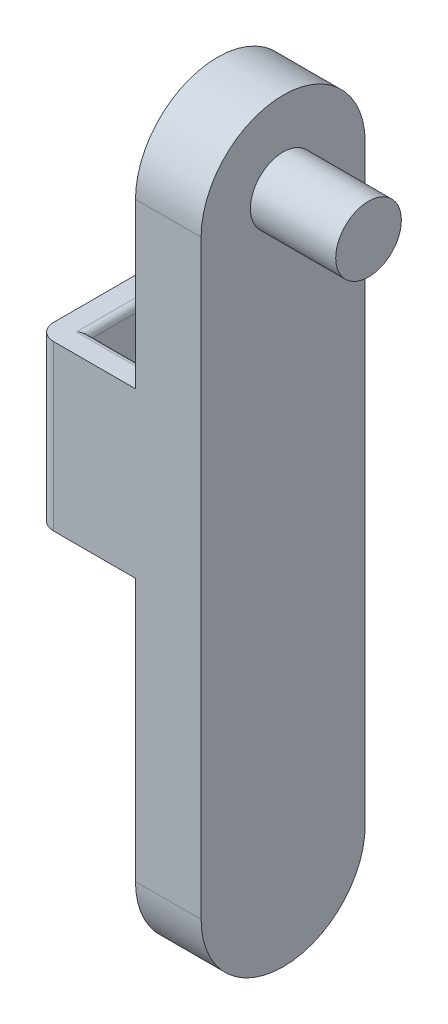
ISO-10303-21;
HEADER;
FILE_DESCRIPTION(('STEP AP214'),'2;1');
FILE_NAME('part.step','',(''),(''),'','','');
FILE_SCHEMA(('AUTOMOTIVE_DESIGN { 1 0 10303 214 1 1 1 1 }'));
ENDSEC;
DATA;
#1=APPLICATION_CONTEXT('core data for automotive mechanical design processes');
#2=APPLICATION_PROTOCOL_DEFINITION('international standard','automotive_design',2000,#1);
#3=PRODUCT_CONTEXT('',#1,'mechanical');
#4=PRODUCT('Part','Part','',(#3));
#5=PRODUCT_RELATED_PRODUCT_CATEGORY('part','',(#4));
#6=PRODUCT_DEFINITION_FORMATION('','',#4);
#7=PRODUCT_DEFINITION_CONTEXT('part definition',#1,'design');
#8=PRODUCT_DEFINITION('design','',#6,#7);
#9=PRODUCT_DEFINITION_SHAPE('','',#8);
#10=(LENGTH_UNIT() NAMED_UNIT(*) SI_UNIT(.MILLI.,.METRE.));
#11=(NAMED_UNIT(*) PLANE_ANGLE_UNIT() SI_UNIT($,.RADIAN.));
#12=(NAMED_UNIT(*) SI_UNIT($,.STERADIAN.) SOLID_ANGLE_UNIT());
#13=UNCERTAINTY_MEASURE_WITH_UNIT(LENGTH_MEASURE(1.E-05),#10,'distance_accuracy_value','');
#14=(GEOMETRIC_REPRESENTATION_CONTEXT(3) GLOBAL_UNCERTAINTY_ASSIGNED_CONTEXT((#13)) GLOBAL_UNIT_ASSIGNED_CONTEXT((#10,
#11,#12)) REPRESENTATION_CONTEXT('',''));
#15=CARTESIAN_POINT('',(0.,0.,0.));
#16=DIRECTION('',(0.,0.,1.));
#17=DIRECTION('',(1.,0.,0.));
#18=AXIS2_PLACEMENT_3D('',#15,#16,#17);
#19=CARTESIAN_POINT('',(0.,15.515536013207,14.7349061395775));
#20=DIRECTION('',(-1.,0.,0.));
#21=DIRECTION('',(0.,0.,1.));
#22=AXIS2_PLACEMENT_3D('',#19,#20,#21);
#23=PLANE('',#22);
#24=DIRECTION('',(0.,-1.,0.));
#25=VECTOR('',#24,1.);
#26=CARTESIAN_POINT('',(0.,15.515536013207,17.2349061395775));
#27=LINE('',#26,#25);
#28=CARTESIAN_POINT('',(0.,5.51553601320701,17.2349061395775));
#29=VERTEX_POINT('',#28);
#30=CARTESIAN_POINT('',(0.,-2.48446398679299,17.2349061395775));
#31=VERTEX_POINT('',#30);
#32=EDGE_CURVE('E218',#29,#31,#27,.T.);
#33=ORIENTED_EDGE('',*,*,#32,.F.);
#34=DIRECTION('',(0.,0.,-1.));
#35=VECTOR('',#34,1.);
#36=CARTESIAN_POINT('',(0.,5.51553601320701,23.0658580344228));
#37=LINE('',#36,#35);
#38=CARTESIAN_POINT('',(0.,5.51553601320701,12.2349061395775));
#39=VERTEX_POINT('',#38);
#40=EDGE_CURVE('E173',#29,#39,#37,.T.);
#41=ORIENTED_EDGE('',*,*,#40,.T.);
#42=DIRECTION('',(0.,1.,0.));
#43=VECTOR('',#42,1.);
#44=CARTESIAN_POINT('',(0.,15.515536013207,12.2349061395775));
#45=LINE('',#44,#43);
#46=CARTESIAN_POINT('',(0.,-2.48446398679299,12.2349061395775));
#47=VERTEX_POINT('',#46);
#48=EDGE_CURVE('E183',#47,#39,#45,.T.);
#49=ORIENTED_EDGE('',*,*,#48,.F.);
#50=CARTESIAN_POINT('',(0.,-2.48446398679299,14.7349061395775));
#51=DIRECTION('',(1.,0.,0.));
#52=DIRECTION('',(0.,0.,1.));
#53=AXIS2_PLACEMENT_3D('',#50,#51,#52);
#54=CIRCLE('',#53,2.5);
#55=EDGE_CURVE('E184',#31,#47,#54,.T.);
#56=ORIENTED_EDGE('',*,*,#55,.F.);
#57=EDGE_LOOP('',(#33,#41,#49,#56));
#58=FACE_BOUND('',#57,.T.);
#59=ADVANCED_FACE('F35',(#58),#23,.T.);
#60=CARTESIAN_POINT('',(2.,15.515536013207,14.7349061395775));
#61=DIRECTION('',(-1.,0.,0.));
#62=DIRECTION('',(0.,0.,1.));
#63=AXIS2_PLACEMENT_3D('',#60,#61,#62);
#64=CYLINDRICAL_SURFACE('',#63,2.5);
#65=CARTESIAN_POINT('',(0.,15.515536013207,14.7349061395775));
#66=DIRECTION('',(1.,0.,0.));
#67=DIRECTION('',(0.,0.,1.));
#68=AXIS2_PLACEMENT_3D('',#65,#66,#67);
#69=CIRCLE('',#68,2.5);
#70=CARTESIAN_POINT('',(0.,15.515536013207,12.2349061395775));
#71=VERTEX_POINT('',#70);
#72=CARTESIAN_POINT('',(0.,15.515536013207,17.2349061395775));
#73=VERTEX_POINT('',#72);
#74=EDGE_CURVE('E182',#71,#73,#69,.T.);
#75=ORIENTED_EDGE('',*,*,#74,.T.);
#76=DIRECTION('',(-1.,0.,0.));
#77=VECTOR('',#76,1.);
#78=CARTESIAN_POINT('',(2.,15.515536013207,17.2349061395775));
#79=LINE('',#78,#77);
#80=CARTESIAN_POINT('',(2.,15.515536013207,17.2349061395775));
#81=VERTEX_POINT('',#80);
#82=EDGE_CURVE('E230',#81,#73,#79,.T.);
#83=ORIENTED_EDGE('',*,*,#82,.F.);
#84=CARTESIAN_POINT('',(2.,15.515536013207,14.7349061395775));
#85=DIRECTION('',(1.,0.,0.));
#86=DIRECTION('',(0.,0.,1.));
#87=AXIS2_PLACEMENT_3D('',#84,#85,#86);
#88=CIRCLE('',#87,2.5);
#89=CARTESIAN_POINT('',(2.,15.515536013207,12.2349061395775));
#90=VERTEX_POINT('',#89);
#91=EDGE_CURVE('E207',#90,#81,#88,.T.);
#92=ORIENTED_EDGE('',*,*,#91,.F.);
#93=DIRECTION('',(-1.,0.,0.));
#94=VECTOR('',#93,1.);
#95=CARTESIAN_POINT('',(2.,15.515536013207,12.2349061395775));
#96=LINE('',#95,#94);
#97=EDGE_CURVE('E216',#90,#71,#96,.T.);
#98=ORIENTED_EDGE('',*,*,#97,.T.);
#99=EDGE_LOOP('',(#75,#83,#92,#98));
#100=FACE_BOUND('',#99,.T.);
#101=ADVANCED_FACE('F356',(#100),#64,.T.);
#102=CARTESIAN_POINT('',(2.,15.515536013207,17.2349061395775));
#103=DIRECTION('',(0.,0.,-1.));
#104=DIRECTION('',(-1.,0.,0.));
#105=AXIS2_PLACEMENT_3D('',#102,#103,#104);
#106=PLANE('',#105);
#107=DIRECTION('',(-1.,0.,0.));
#108=VECTOR('',#107,1.);
#109=CARTESIAN_POINT('',(0.,10.515536013207,17.2349061395775));
#110=LINE('',#109,#108);
#111=CARTESIAN_POINT('',(0.,10.515536013207,17.2349061395775));
#112=VERTEX_POINT('',#111);
#113=CARTESIAN_POINT('',(-2.5,10.515536013207,17.2349061395775));
#114=VERTEX_POINT('',#113);
#115=EDGE_CURVE('E190',#112,#114,#110,.T.);
#116=ORIENTED_EDGE('',*,*,#115,.T.);
#117=DIRECTION('',(0.,-1.,0.));
#118=VECTOR('',#117,1.);
#119=CARTESIAN_POINT('',(-2.5,5.51553601320701,17.2349061395775));
#120=LINE('',#119,#118);
#121=CARTESIAN_POINT('',(-2.5,5.51553601320701,17.2349061395775));
#122=VERTEX_POINT('',#121);
#123=EDGE_CURVE('E236',#114,#122,#120,.T.);
#124=ORIENTED_EDGE('',*,*,#123,.T.);
#125=DIRECTION('',(1.,0.,0.));
#126=VECTOR('',#125,1.);
#127=CARTESIAN_POINT('',(0.,5.51553601320701,17.2349061395775));
#128=LINE('',#127,#126);
#129=EDGE_CURVE('E193',#122,#29,#128,.T.);
#130=ORIENTED_EDGE('',*,*,#129,.T.);
#131=ORIENTED_EDGE('',*,*,#32,.T.);
#132=DIRECTION('',(-1.,0.,0.));
#133=VECTOR('',#132,1.);
#134=CARTESIAN_POINT('',(2.,-2.48446398679299,17.2349061395775));
#135=LINE('',#134,#133);
#136=CARTESIAN_POINT('',(2.,-2.48446398679299,17.2349061395775));
#137=VERTEX_POINT('',#136);
#138=EDGE_CURVE('E227',#137,#31,#135,.T.);
#139=ORIENTED_EDGE('',*,*,#138,.F.);
#140=DIRECTION('',(0.,-1.,0.));
#141=VECTOR('',#140,1.);
#142=CARTESIAN_POINT('',(2.,15.515536013207,17.2349061395775));
#143=LINE('',#142,#141);
#144=EDGE_CURVE('E210',#81,#137,#143,.T.);
#145=ORIENTED_EDGE('',*,*,#144,.F.);
#146=ORIENTED_EDGE('',*,*,#82,.T.);
#147=EDGE_CURVE('E219',#73,#112,#27,.T.);
#148=ORIENTED_EDGE('',*,*,#147,.T.);
#149=EDGE_LOOP('',(#116,#124,#130,#131,#139,#145,#146,#148));
#150=FACE_BOUND('',#149,.T.);
#151=ADVANCED_FACE('F350',(#150),#106,.F.);
#152=CARTESIAN_POINT('',(2.,-2.48446398679299,14.7349061395775));
#153=DIRECTION('',(-1.,0.,0.));
#154=DIRECTION('',(0.,0.,1.));
#155=AXIS2_PLACEMENT_3D('',#152,#153,#154);
#156=CYLINDRICAL_SURFACE('',#155,2.5);
#157=ORIENTED_EDGE('',*,*,#55,.T.);
#158=DIRECTION('',(-1.,0.,0.));
#159=VECTOR('',#158,1.);
#160=CARTESIAN_POINT('',(2.,-2.48446398679299,12.2349061395775));
#161=LINE('',#160,#159);
#162=CARTESIAN_POINT('',(2.,-2.48446398679299,12.2349061395775));
#163=VERTEX_POINT('',#162);
#164=EDGE_CURVE('E224',#163,#47,#161,.T.);
#165=ORIENTED_EDGE('',*,*,#164,.F.);
#166=CARTESIAN_POINT('',(2.,-2.48446398679299,14.7349061395775));
#167=DIRECTION('',(1.,0.,0.));
#168=DIRECTION('',(0.,0.,1.));
#169=AXIS2_PLACEMENT_3D('',#166,#167,#168);
#170=CIRCLE('',#169,2.5);
#171=EDGE_CURVE('E212',#137,#163,#170,.T.);
#172=ORIENTED_EDGE('',*,*,#171,.F.);
#173=ORIENTED_EDGE('',*,*,#138,.T.);
#174=EDGE_LOOP('',(#157,#165,#172,#173));
#175=FACE_BOUND('',#174,.T.);
#176=ADVANCED_FACE('F363',(#175),#156,.T.);
#177=CARTESIAN_POINT('',(2.,15.515536013207,12.2349061395775));
#178=DIRECTION('',(0.,0.,1.));
#179=DIRECTION('',(0.,-1.,0.));
#180=AXIS2_PLACEMENT_3D('',#177,#178,#179);
#181=PLANE('',#180);
#182=DIRECTION('',(-1.,0.,0.));
#183=VECTOR('',#182,1.);
#184=CARTESIAN_POINT('',(0.,5.51553601320701,12.2349061395775));
#185=LINE('',#184,#183);
#186=CARTESIAN_POINT('',(-2.5,5.51553601320701,12.2349061395775));
#187=VERTEX_POINT('',#186);
#188=EDGE_CURVE('E174',#39,#187,#185,.T.);
#189=ORIENTED_EDGE('',*,*,#188,.T.);
#190=DIRECTION('',(0.,1.,0.));
#191=VECTOR('',#190,1.);
#192=CARTESIAN_POINT('',(-2.5,10.515536013207,12.2349061395775));
#193=LINE('',#192,#191);
#194=CARTESIAN_POINT('',(-2.5,10.515536013207,12.2349061395775));
#195=VERTEX_POINT('',#194);
#196=EDGE_CURVE('E170',#187,#195,#193,.T.);
#197=ORIENTED_EDGE('',*,*,#196,.T.);
#198=DIRECTION('',(1.,0.,0.));
#199=VECTOR('',#198,1.);
#200=CARTESIAN_POINT('',(0.,10.515536013207,12.2349061395775));
#201=LINE('',#200,#199);
#202=CARTESIAN_POINT('',(0.,10.515536013207,12.2349061395775));
#203=VERTEX_POINT('',#202);
#204=EDGE_CURVE('E162',#195,#203,#201,.T.);
#205=ORIENTED_EDGE('',*,*,#204,.T.);
#206=EDGE_CURVE('E167',#203,#71,#45,.T.);
#207=ORIENTED_EDGE('',*,*,#206,.T.);
#208=ORIENTED_EDGE('',*,*,#97,.F.);
#209=DIRECTION('',(0.,1.,0.));
#210=VECTOR('',#209,1.);
#211=CARTESIAN_POINT('',(2.,15.515536013207,12.2349061395775));
#212=LINE('',#211,#210);
#213=EDGE_CURVE('E214',#163,#90,#212,.T.);
#214=ORIENTED_EDGE('',*,*,#213,.F.);
#215=ORIENTED_EDGE('',*,*,#164,.T.);
#216=ORIENTED_EDGE('',*,*,#48,.T.);
#217=EDGE_LOOP('',(#189,#197,#205,#207,#208,#214,#215,#216));
#218=FACE_BOUND('',#217,.T.);
#219=ADVANCED_FACE('F165',(#218),#181,.F.);
#220=CARTESIAN_POINT('',(2.,15.515536013207,14.7349061395775));
#221=DIRECTION('',(-1.,0.,0.));
#222=DIRECTION('',(0.,0.,1.));
#223=AXIS2_PLACEMENT_3D('',#220,#221,#222);
#224=PLANE('',#223);
#225=CARTESIAN_POINT('',(2.,15.515536013207,14.7349061395775));
#226=DIRECTION('',(-1.,0.,0.));
#227=DIRECTION('',(0.,0.,1.));
#228=AXIS2_PLACEMENT_3D('',#225,#226,#227);
#229=CIRCLE('',#228,1.);
#230=CARTESIAN_POINT('',(2.,15.515536013207,15.7349061395775));
#231=VERTEX_POINT('',#230);
#232=EDGE_CURVE('E233',#231,#231,#229,.F.);
#233=ORIENTED_EDGE('',*,*,#232,.F.);
#234=EDGE_LOOP('',(#233));
#235=FACE_BOUND('',#234,.T.);
#236=ORIENTED_EDGE('',*,*,#91,.T.);
#237=ORIENTED_EDGE('',*,*,#144,.T.);
#238=ORIENTED_EDGE('',*,*,#171,.T.);
#239=ORIENTED_EDGE('',*,*,#213,.T.);
#240=EDGE_LOOP('',(#236,#237,#238,#239));
#241=FACE_BOUND('',#240,.T.);
#242=ADVANCED_FACE('F360',(#235,#241),#224,.F.);
#243=DIRECTION('',(0.,0.,-1.));
#244=VECTOR('',#243,1.);
#245=CARTESIAN_POINT('',(0.,10.515536013207,23.0658580344228));
#246=LINE('',#245,#244);
#247=EDGE_CURVE('E179',#112,#203,#246,.T.);
#248=ORIENTED_EDGE('',*,*,#247,.F.);
#249=ORIENTED_EDGE('',*,*,#147,.F.);
#250=ORIENTED_EDGE('',*,*,#74,.F.);
#251=ORIENTED_EDGE('',*,*,#206,.F.);
#252=EDGE_LOOP('',(#248,#249,#250,#251));
#253=FACE_BOUND('',#252,.T.);
#254=ADVANCED_FACE('F178',(#253),#23,.T.);
#255=CARTESIAN_POINT('',(4.6,15.515536013207,14.7349061395775));
#256=DIRECTION('',(-1.,0.,0.));
#257=DIRECTION('',(0.,0.,1.));
#258=AXIS2_PLACEMENT_3D('',#255,#256,#257);
#259=CYLINDRICAL_SURFACE('',#258,1.);
#260=CARTESIAN_POINT('',(4.6,15.515536013207,14.7349061395775));
#261=DIRECTION('',(1.,0.,0.));
#262=DIRECTION('',(0.,0.,-1.));
#263=AXIS2_PLACEMENT_3D('',#260,#261,#262);
#264=CIRCLE('',#263,1.);
#265=CARTESIAN_POINT('',(4.6,15.515536013207,13.7349061395775));
#266=VERTEX_POINT('',#265);
#267=EDGE_CURVE('E204',#266,#266,#264,.T.);
#268=ORIENTED_EDGE('',*,*,#267,.F.);
#269=EDGE_LOOP('',(#268));
#270=FACE_BOUND('',#269,.T.);
#271=ORIENTED_EDGE('',*,*,#232,.T.);
#272=EDGE_LOOP('',(#271));
#273=FACE_BOUND('',#272,.T.);
#274=ADVANCED_FACE('F390',(#270,#273),#259,.T.);
#275=CARTESIAN_POINT('',(4.6,15.515536013207,14.7349061395775));
#276=DIRECTION('',(1.,0.,0.));
#277=DIRECTION('',(0.,0.,-1.));
#278=AXIS2_PLACEMENT_3D('',#275,#276,#277);
#279=PLANE('',#278);
#280=ORIENTED_EDGE('',*,*,#267,.T.);
#281=EDGE_LOOP('',(#280));
#282=FACE_BOUND('',#281,.T.);
#283=ADVANCED_FACE('F395',(#282),#279,.T.);
#284=CARTESIAN_POINT('',(0.,10.515536013207,23.0658580344228));
#285=DIRECTION('',(0.,1.,0.));
#286=DIRECTION('',(0.,0.,1.));
#287=AXIS2_PLACEMENT_3D('',#284,#285,#286);
#288=PLANE('',#287);
#289=DIRECTION('',(1.,0.,0.));
#290=VECTOR('',#289,1.);
#291=CARTESIAN_POINT('',(-2.2,10.515536013207,16.6349061395775));
#292=LINE('',#291,#290);
#293=CARTESIAN_POINT('',(-0.6,10.515536013207,16.6349061395775));
#294=VERTEX_POINT('',#293);
#295=CARTESIAN_POINT('',(-2.4,10.515536013207,16.6349061395775));
#296=VERTEX_POINT('',#295);
#297=EDGE_CURVE('E44',#294,#296,#292,.F.);
#298=ORIENTED_EDGE('',*,*,#297,.T.);
#299=DIRECTION('',(0.,0.,1.));
#300=VECTOR('',#299,1.);
#301=CARTESIAN_POINT('',(-2.4,10.515536013207,13.0349061395775));
#302=LINE('',#301,#300);
#303=CARTESIAN_POINT('',(-2.4,10.515536013207,12.8349061395775));
#304=VERTEX_POINT('',#303);
#305=EDGE_CURVE('E11',#296,#304,#302,.F.);
#306=ORIENTED_EDGE('',*,*,#305,.T.);
#307=DIRECTION('',(-1.,0.,0.));
#308=VECTOR('',#307,1.);
#309=CARTESIAN_POINT('',(-0.8,10.515536013207,12.8349061395775));
#310=LINE('',#309,#308);
#311=CARTESIAN_POINT('',(-0.6,10.515536013207,12.8349061395775));
#312=VERTEX_POINT('',#311);
#313=EDGE_CURVE('E281',#304,#312,#310,.F.);
#314=ORIENTED_EDGE('',*,*,#313,.T.);
#315=DIRECTION('',(0.,0.,-1.));
#316=VECTOR('',#315,1.);
#317=CARTESIAN_POINT('',(-0.6,10.515536013207,16.4349061395775));
#318=LINE('',#317,#316);
#319=EDGE_CURVE('E279',#312,#294,#318,.F.);
#320=ORIENTED_EDGE('',*,*,#319,.T.);
#321=EDGE_LOOP('',(#298,#306,#314,#320));
#322=FACE_BOUND('',#321,.T.);
#323=DIRECTION('',(0.,0.,-1.));
#324=VECTOR('',#323,1.);
#325=CARTESIAN_POINT('',(-3.,10.515536013207,23.0658580344228));
#326=LINE('',#325,#324);
#327=CARTESIAN_POINT('',(-3.,10.515536013207,16.7349061395775));
#328=VERTEX_POINT('',#327);
#329=CARTESIAN_POINT('',(-3.,10.515536013207,12.7349061395775));
#330=VERTEX_POINT('',#329);
#331=EDGE_CURVE('E191',#328,#330,#326,.T.);
#332=ORIENTED_EDGE('',*,*,#331,.F.);
#333=CARTESIAN_POINT('',(-2.5,10.515536013207,16.7349061395775));
#334=DIRECTION('',(0.,1.,0.));
#335=DIRECTION('',(0.,0.,1.));
#336=AXIS2_PLACEMENT_3D('',#333,#334,#335);
#337=CIRCLE('',#336,0.5);
#338=EDGE_CURVE('E249',#328,#114,#337,.T.);
#339=ORIENTED_EDGE('',*,*,#338,.T.);
#340=ORIENTED_EDGE('',*,*,#115,.F.);
#341=ORIENTED_EDGE('',*,*,#247,.T.);
#342=ORIENTED_EDGE('',*,*,#204,.F.);
#343=CARTESIAN_POINT('',(-2.5,10.515536013207,12.7349061395775));
#344=DIRECTION('',(0.,1.,0.));
#345=DIRECTION('',(0.,0.,1.));
#346=AXIS2_PLACEMENT_3D('',#343,#344,#345);
#347=CIRCLE('',#346,0.5);
#348=EDGE_CURVE('E247',#195,#330,#347,.T.);
#349=ORIENTED_EDGE('',*,*,#348,.T.);
#350=EDGE_LOOP('',(#332,#339,#340,#341,#342,#349));
#351=FACE_BOUND('',#350,.T.);
#352=ADVANCED_FACE('F188',(#322,#351),#288,.T.);
#353=CARTESIAN_POINT('',(-3.,10.515536013207,23.0658580344228));
#354=DIRECTION('',(-1.,0.,0.));
#355=DIRECTION('',(0.,0.,1.));
#356=AXIS2_PLACEMENT_3D('',#353,#354,#355);
#357=PLANE('',#356);
#358=DIRECTION('',(0.,0.,-1.));
#359=VECTOR('',#358,1.);
#360=CARTESIAN_POINT('',(-3.,5.51553601320701,23.0658580344228));
#361=LINE('',#360,#359);
#362=CARTESIAN_POINT('',(-3.,5.51553601320701,16.7349061395775));
#363=VERTEX_POINT('',#362);
#364=CARTESIAN_POINT('',(-3.,5.51553601320701,12.7349061395775));
#365=VERTEX_POINT('',#364);
#366=EDGE_CURVE('E196',#363,#365,#361,.T.);
#367=ORIENTED_EDGE('',*,*,#366,.F.);
#368=DIRECTION('',(0.,-1.,0.));
#369=VECTOR('',#368,1.);
#370=CARTESIAN_POINT('',(-3.,10.515536013207,16.7349061395775));
#371=LINE('',#370,#369);
#372=EDGE_CURVE('E245',#363,#328,#371,.F.);
#373=ORIENTED_EDGE('',*,*,#372,.T.);
#374=ORIENTED_EDGE('',*,*,#331,.T.);
#375=DIRECTION('',(0.,1.,0.));
#376=VECTOR('',#375,1.);
#377=CARTESIAN_POINT('',(-3.,5.51553601320701,12.7349061395775));
#378=LINE('',#377,#376);
#379=EDGE_CURVE('E243',#330,#365,#378,.F.);
#380=ORIENTED_EDGE('',*,*,#379,.T.);
#381=EDGE_LOOP('',(#367,#373,#374,#380));
#382=FACE_BOUND('',#381,.T.);
#383=ADVANCED_FACE('F344',(#382),#357,.T.);
#384=CARTESIAN_POINT('',(0.,5.51553601320701,23.0658580344228));
#385=DIRECTION('',(0.,-1.,0.));
#386=DIRECTION('',(0.,0.,-1.));
#387=AXIS2_PLACEMENT_3D('',#384,#385,#386);
#388=PLANE('',#387);
#389=DIRECTION('',(0.,0.,1.));
#390=VECTOR('',#389,1.);
#391=CARTESIAN_POINT('',(-0.6,5.51553601320701,13.0349061395775));
#392=LINE('',#391,#390);
#393=CARTESIAN_POINT('',(-0.6,5.51553601320701,16.6349061395775));
#394=VERTEX_POINT('',#393);
#395=CARTESIAN_POINT('',(-0.6,5.51553601320701,12.8349061395775));
#396=VERTEX_POINT('',#395);
#397=EDGE_CURVE('E257',#394,#396,#392,.F.);
#398=ORIENTED_EDGE('',*,*,#397,.T.);
#399=DIRECTION('',(1.,0.,0.));
#400=VECTOR('',#399,1.);
#401=CARTESIAN_POINT('',(-2.2,5.51553601320701,12.8349061395775));
#402=LINE('',#401,#400);
#403=CARTESIAN_POINT('',(-2.4,5.51553601320701,12.8349061395775));
#404=VERTEX_POINT('',#403);
#405=EDGE_CURVE('E263',#396,#404,#402,.F.);
#406=ORIENTED_EDGE('',*,*,#405,.T.);
#407=DIRECTION('',(0.,0.,-1.));
#408=VECTOR('',#407,1.);
#409=CARTESIAN_POINT('',(-2.4,5.51553601320701,16.4349061395775));
#410=LINE('',#409,#408);
#411=CARTESIAN_POINT('',(-2.4,5.51553601320701,16.6349061395775));
#412=VERTEX_POINT('',#411);
#413=EDGE_CURVE('E261',#404,#412,#410,.F.);
#414=ORIENTED_EDGE('',*,*,#413,.T.);
#415=DIRECTION('',(-1.,0.,0.));
#416=VECTOR('',#415,1.);
#417=CARTESIAN_POINT('',(-0.8,5.51553601320701,16.6349061395775));
#418=LINE('',#417,#416);
#419=EDGE_CURVE('E259',#412,#394,#418,.F.);
#420=ORIENTED_EDGE('',*,*,#419,.T.);
#421=EDGE_LOOP('',(#398,#406,#414,#420));
#422=FACE_BOUND('',#421,.T.);
#423=ORIENTED_EDGE('',*,*,#129,.F.);
#424=CARTESIAN_POINT('',(-2.5,5.51553601320701,16.7349061395775));
#425=DIRECTION('',(0.,-1.,0.));
#426=DIRECTION('',(0.,0.,-1.));
#427=AXIS2_PLACEMENT_3D('',#424,#425,#426);
#428=CIRCLE('',#427,0.5);
#429=EDGE_CURVE('E241',#122,#363,#428,.T.);
#430=ORIENTED_EDGE('',*,*,#429,.T.);
#431=ORIENTED_EDGE('',*,*,#366,.T.);
#432=CARTESIAN_POINT('',(-2.5,5.51553601320702,12.7349061395775));
#433=DIRECTION('',(0.,-1.,0.));
#434=DIRECTION('',(0.,0.,-1.));
#435=AXIS2_PLACEMENT_3D('',#432,#433,#434);
#436=CIRCLE('',#435,0.5);
#437=EDGE_CURVE('E239',#365,#187,#436,.T.);
#438=ORIENTED_EDGE('',*,*,#437,.T.);
#439=ORIENTED_EDGE('',*,*,#188,.F.);
#440=ORIENTED_EDGE('',*,*,#40,.F.);
#441=EDGE_LOOP('',(#423,#430,#431,#438,#439,#440));
#442=FACE_BOUND('',#441,.T.);
#443=ADVANCED_FACE('F367',(#422,#442),#388,.T.);
#444=CARTESIAN_POINT('',(-0.8,-4.98446398679299,16.4349061395775));
#445=DIRECTION('',(1.,0.,0.));
#446=DIRECTION('',(0.,0.,-1.));
#447=AXIS2_PLACEMENT_3D('',#444,#445,#446);
#448=PLANE('',#447);
#449=DIRECTION('',(0.,1.,0.));
#450=VECTOR('',#449,1.);
#451=CARTESIAN_POINT('',(-0.8,-4.98446398679299,13.0349061395775));
#452=LINE('',#451,#450);
#453=CARTESIAN_POINT('',(-0.8,5.71553601320701,13.0349061395775));
#454=VERTEX_POINT('',#453);
#455=CARTESIAN_POINT('',(-0.8,10.315536013207,13.0349061395775));
#456=VERTEX_POINT('',#455);
#457=EDGE_CURVE('E294',#454,#456,#452,.T.);
#458=ORIENTED_EDGE('',*,*,#457,.F.);
#459=DIRECTION('',(0.,0.,1.));
#460=VECTOR('',#459,1.);
#461=CARTESIAN_POINT('',(-0.8,5.71553601320701,16.4349061395775));
#462=LINE('',#461,#460);
#463=CARTESIAN_POINT('',(-0.8,5.71553601320701,16.4349061395775));
#464=VERTEX_POINT('',#463);
#465=EDGE_CURVE('E277',#454,#464,#462,.T.);
#466=ORIENTED_EDGE('',*,*,#465,.T.);
#467=DIRECTION('',(0.,1.,0.));
#468=VECTOR('',#467,1.);
#469=CARTESIAN_POINT('',(-0.8,-4.98446398679299,16.4349061395775));
#470=LINE('',#469,#468);
#471=CARTESIAN_POINT('',(-0.8,10.315536013207,16.4349061395775));
#472=VERTEX_POINT('',#471);
#473=EDGE_CURVE('E327',#464,#472,#470,.T.);
#474=ORIENTED_EDGE('',*,*,#473,.T.);
#475=DIRECTION('',(0.,0.,-1.));
#476=VECTOR('',#475,1.);
#477=CARTESIAN_POINT('',(-0.8,10.315536013207,13.0349061395775));
#478=LINE('',#477,#476);
#479=EDGE_CURVE('E275',#472,#456,#478,.T.);
#480=ORIENTED_EDGE('',*,*,#479,.T.);
#481=EDGE_LOOP('',(#458,#466,#474,#480));
#482=FACE_BOUND('',#481,.T.);
#483=ADVANCED_FACE('F369',(#482),#448,.F.);
#484=CARTESIAN_POINT('',(-0.8,-4.98446398679299,16.4349061395775));
#485=DIRECTION('',(0.,0.,1.));
#486=DIRECTION('',(0.,-1.,0.));
#487=AXIS2_PLACEMENT_3D('',#484,#485,#486);
#488=PLANE('',#487);
#489=ORIENTED_EDGE('',*,*,#473,.F.);
#490=DIRECTION('',(-1.,0.,0.));
#491=VECTOR('',#490,1.);
#492=CARTESIAN_POINT('',(-2.2,5.71553601320701,16.4349061395775));
#493=LINE('',#492,#491);
#494=CARTESIAN_POINT('',(-2.2,5.71553601320701,16.4349061395775));
#495=VERTEX_POINT('',#494);
#496=EDGE_CURVE('E273',#464,#495,#493,.T.);
#497=ORIENTED_EDGE('',*,*,#496,.T.);
#498=DIRECTION('',(0.,1.,0.));
#499=VECTOR('',#498,1.);
#500=CARTESIAN_POINT('',(-2.2,-4.98446398679299,16.4349061395775));
#501=LINE('',#500,#499);
#502=CARTESIAN_POINT('',(-2.2,10.315536013207,16.4349061395775));
#503=VERTEX_POINT('',#502);
#504=EDGE_CURVE('E321',#495,#503,#501,.T.);
#505=ORIENTED_EDGE('',*,*,#504,.T.);
#506=DIRECTION('',(1.,0.,0.));
#507=VECTOR('',#506,1.);
#508=CARTESIAN_POINT('',(-0.8,10.315536013207,16.4349061395775));
#509=LINE('',#508,#507);
#510=EDGE_CURVE('E271',#503,#472,#509,.T.);
#511=ORIENTED_EDGE('',*,*,#510,.T.);
#512=EDGE_LOOP('',(#489,#497,#505,#511));
#513=FACE_BOUND('',#512,.T.);
#514=ADVANCED_FACE('F325',(#513),#488,.F.);
#515=CARTESIAN_POINT('',(-2.2,-4.98446398679299,16.4349061395775));
#516=DIRECTION('',(-1.,0.,0.));
#517=DIRECTION('',(0.,0.,1.));
#518=AXIS2_PLACEMENT_3D('',#515,#516,#517);
#519=PLANE('',#518);
#520=ORIENTED_EDGE('',*,*,#504,.F.);
#521=DIRECTION('',(0.,0.,-1.));
#522=VECTOR('',#521,1.);
#523=CARTESIAN_POINT('',(-2.2,5.71553601320701,13.0349061395775));
#524=LINE('',#523,#522);
#525=CARTESIAN_POINT('',(-2.2,5.71553601320701,13.0349061395775));
#526=VERTEX_POINT('',#525);
#527=EDGE_CURVE('E269',#495,#526,#524,.T.);
#528=ORIENTED_EDGE('',*,*,#527,.T.);
#529=DIRECTION('',(0.,1.,0.));
#530=VECTOR('',#529,1.);
#531=CARTESIAN_POINT('',(-2.2,-4.98446398679299,13.0349061395775));
#532=LINE('',#531,#530);
#533=CARTESIAN_POINT('',(-2.2,10.315536013207,13.0349061395775));
#534=VERTEX_POINT('',#533);
#535=EDGE_CURVE('E324',#526,#534,#532,.T.);
#536=ORIENTED_EDGE('',*,*,#535,.T.);
#537=DIRECTION('',(0.,0.,1.));
#538=VECTOR('',#537,1.);
#539=CARTESIAN_POINT('',(-2.2,10.315536013207,16.4349061395775));
#540=LINE('',#539,#538);
#541=EDGE_CURVE('E266',#534,#503,#540,.T.);
#542=ORIENTED_EDGE('',*,*,#541,.T.);
#543=EDGE_LOOP('',(#520,#528,#536,#542));
#544=FACE_BOUND('',#543,.T.);
#545=ADVANCED_FACE('F320',(#544),#519,.F.);
#546=CARTESIAN_POINT('',(-0.8,-4.98446398679299,13.0349061395775));
#547=DIRECTION('',(0.,0.,-1.));
#548=DIRECTION('',(0.,1.,0.));
#549=AXIS2_PLACEMENT_3D('',#546,#547,#548);
#550=PLANE('',#549);
#551=ORIENTED_EDGE('',*,*,#535,.F.);
#552=DIRECTION('',(1.,0.,0.));
#553=VECTOR('',#552,1.);
#554=CARTESIAN_POINT('',(-0.8,5.71553601320701,13.0349061395775));
#555=LINE('',#554,#553);
#556=EDGE_CURVE('E254',#526,#454,#555,.T.);
#557=ORIENTED_EDGE('',*,*,#556,.T.);
#558=ORIENTED_EDGE('',*,*,#457,.T.);
#559=DIRECTION('',(-1.,0.,0.));
#560=VECTOR('',#559,1.);
#561=CARTESIAN_POINT('',(-2.2,10.315536013207,13.0349061395775));
#562=LINE('',#561,#560);
#563=EDGE_CURVE('E252',#456,#534,#562,.T.);
#564=ORIENTED_EDGE('',*,*,#563,.T.);
#565=EDGE_LOOP('',(#551,#557,#558,#564));
#566=FACE_BOUND('',#565,.T.);
#567=ADVANCED_FACE('F415',(#566),#550,.F.);
#568=CARTESIAN_POINT('',(-2.5,15.515536013207,16.7349061395775));
#569=DIRECTION('',(0.,1.,0.));
#570=DIRECTION('',(0.,0.,1.));
#571=AXIS2_PLACEMENT_3D('',#568,#569,#570);
#572=CYLINDRICAL_SURFACE('',#571,0.5);
#573=ORIENTED_EDGE('',*,*,#338,.F.);
#574=ORIENTED_EDGE('',*,*,#372,.F.);
#575=ORIENTED_EDGE('',*,*,#429,.F.);
#576=ORIENTED_EDGE('',*,*,#123,.F.);
#577=EDGE_LOOP('',(#573,#574,#575,#576));
#578=FACE_BOUND('',#577,.T.);
#579=ADVANCED_FACE('F347',(#578),#572,.T.);
#580=CARTESIAN_POINT('',(-2.5,15.515536013207,12.7349061395775));
#581=DIRECTION('',(0.,-1.,0.));
#582=DIRECTION('',(0.,0.,-1.));
#583=AXIS2_PLACEMENT_3D('',#580,#581,#582);
#584=CYLINDRICAL_SURFACE('',#583,0.5);
#585=ORIENTED_EDGE('',*,*,#437,.F.);
#586=ORIENTED_EDGE('',*,*,#379,.F.);
#587=ORIENTED_EDGE('',*,*,#348,.F.);
#588=ORIENTED_EDGE('',*,*,#196,.F.);
#589=EDGE_LOOP('',(#585,#586,#587,#588));
#590=FACE_BOUND('',#589,.T.);
#591=ADVANCED_FACE('F339',(#590),#584,.T.);
#592=CARTESIAN_POINT('',(-0.8,5.71553601320701,16.6349061395775));
#593=DIRECTION('',(1.,0.,0.));
#594=DIRECTION('',(0.,0.,-1.));
#595=AXIS2_PLACEMENT_3D('',#592,#593,#594);
#596=CYLINDRICAL_SURFACE('',#595,0.2);
#597=CARTESIAN_POINT('',(-0.6,5.71553601320701,16.6349061395775));
#598=DIRECTION('',(0.707106781186547,0.,-0.707106781186547));
#599=DIRECTION('',(0.707106781186547,0.,0.707106781186547));
#600=AXIS2_PLACEMENT_3D('',#597,#598,#599);
#601=ELLIPSE('',#600,0.282842712474619,0.2);
#602=EDGE_CURVE('E288',#394,#464,#601,.T.);
#603=ORIENTED_EDGE('',*,*,#602,.F.);
#604=ORIENTED_EDGE('',*,*,#419,.F.);
#605=CARTESIAN_POINT('',(-2.4,5.71553601320701,16.6349061395775));
#606=DIRECTION('',(0.707106781186547,0.,0.707106781186547));
#607=DIRECTION('',(-0.707106781186547,0.,0.707106781186547));
#608=AXIS2_PLACEMENT_3D('',#605,#606,#607);
#609=ELLIPSE('',#608,0.282842712474619,0.2);
#610=EDGE_CURVE('E291',#495,#412,#609,.F.);
#611=ORIENTED_EDGE('',*,*,#610,.F.);
#612=ORIENTED_EDGE('',*,*,#496,.F.);
#613=EDGE_LOOP('',(#603,#604,#611,#612));
#614=FACE_BOUND('',#613,.T.);
#615=ADVANCED_FACE('F448',(#614),#596,.T.);
#616=CARTESIAN_POINT('',(-2.4,5.71553601320701,16.4349061395775));
#617=DIRECTION('',(0.,0.,1.));
#618=DIRECTION('',(0.,-1.,0.));
#619=AXIS2_PLACEMENT_3D('',#616,#617,#618);
#620=CYLINDRICAL_SURFACE('',#619,0.2);
#621=ORIENTED_EDGE('',*,*,#610,.T.);
#622=ORIENTED_EDGE('',*,*,#413,.F.);
#623=CARTESIAN_POINT('',(-2.4,5.71553601320701,12.8349061395775));
#624=DIRECTION('',(-0.707106781186547,0.,0.707106781186547));
#625=DIRECTION('',(-0.707106781186547,0.,-0.707106781186547));
#626=AXIS2_PLACEMENT_3D('',#623,#624,#625);
#627=ELLIPSE('',#626,0.282842712474619,0.2);
#628=EDGE_CURVE('E286',#526,#404,#627,.F.);
#629=ORIENTED_EDGE('',*,*,#628,.F.);
#630=ORIENTED_EDGE('',*,*,#527,.F.);
#631=EDGE_LOOP('',(#621,#622,#629,#630));
#632=FACE_BOUND('',#631,.T.);
#633=ADVANCED_FACE('F454',(#632),#620,.T.);
#634=CARTESIAN_POINT('',(-0.6,5.71553601320701,16.4349061395775));
#635=DIRECTION('',(0.,0.,-1.));
#636=DIRECTION('',(0.,1.,0.));
#637=AXIS2_PLACEMENT_3D('',#634,#635,#636);
#638=CYLINDRICAL_SURFACE('',#637,0.2);
#639=ORIENTED_EDGE('',*,*,#602,.T.);
#640=ORIENTED_EDGE('',*,*,#465,.F.);
#641=CARTESIAN_POINT('',(-0.6,5.71553601320701,12.8349061395775));
#642=DIRECTION('',(-0.707106781186547,0.,-0.707106781186547));
#643=DIRECTION('',(-0.707106781186547,0.,0.707106781186547));
#644=AXIS2_PLACEMENT_3D('',#641,#642,#643);
#645=ELLIPSE('',#644,0.282842712474619,0.2);
#646=EDGE_CURVE('E284',#396,#454,#645,.T.);
#647=ORIENTED_EDGE('',*,*,#646,.F.);
#648=ORIENTED_EDGE('',*,*,#397,.F.);
#649=EDGE_LOOP('',(#639,#640,#647,#648));
#650=FACE_BOUND('',#649,.T.);
#651=ADVANCED_FACE('F462',(#650),#638,.T.);
#652=CARTESIAN_POINT('',(-0.8,5.71553601320701,12.8349061395775));
#653=DIRECTION('',(-1.,0.,0.));
#654=DIRECTION('',(0.,0.,1.));
#655=AXIS2_PLACEMENT_3D('',#652,#653,#654);
#656=CYLINDRICAL_SURFACE('',#655,0.2);
#657=ORIENTED_EDGE('',*,*,#628,.T.);
#658=ORIENTED_EDGE('',*,*,#405,.F.);
#659=ORIENTED_EDGE('',*,*,#646,.T.);
#660=ORIENTED_EDGE('',*,*,#556,.F.);
#661=EDGE_LOOP('',(#657,#658,#659,#660));
#662=FACE_BOUND('',#661,.T.);
#663=ADVANCED_FACE('F470',(#662),#656,.T.);
#664=CARTESIAN_POINT('',(-0.6,10.315536013207,16.4349061395775));
#665=DIRECTION('',(0.,0.,1.));
#666=DIRECTION('',(0.,-1.,0.));
#667=AXIS2_PLACEMENT_3D('',#664,#665,#666);
#668=CYLINDRICAL_SURFACE('',#667,0.2);
#669=CARTESIAN_POINT('',(-0.6,10.315536013207,16.6349061395775));
#670=DIRECTION('',(-0.707106781186547,0.,0.707106781186547));
#671=DIRECTION('',(-0.707106781186547,0.,-0.707106781186547));
#672=AXIS2_PLACEMENT_3D('',#669,#670,#671);
#673=ELLIPSE('',#672,0.282842712474619,0.2);
#674=EDGE_CURVE('E297',#294,#472,#673,.T.);
#675=ORIENTED_EDGE('',*,*,#674,.F.);
#676=ORIENTED_EDGE('',*,*,#319,.F.);
#677=CARTESIAN_POINT('',(-0.6,10.315536013207,12.8349061395775));
#678=DIRECTION('',(0.707106781186547,0.,0.707106781186547));
#679=DIRECTION('',(0.707106781186547,0.,-0.707106781186547));
#680=AXIS2_PLACEMENT_3D('',#677,#678,#679);
#681=ELLIPSE('',#680,0.282842712474619,0.2);
#682=EDGE_CURVE('E39',#456,#312,#681,.F.);
#683=ORIENTED_EDGE('',*,*,#682,.F.);
#684=ORIENTED_EDGE('',*,*,#479,.F.);
#685=EDGE_LOOP('',(#675,#676,#683,#684));
#686=FACE_BOUND('',#685,.T.);
#687=ADVANCED_FACE('F37',(#686),#668,.T.);
#688=CARTESIAN_POINT('',(-0.8,10.315536013207,12.8349061395775));
#689=DIRECTION('',(1.,0.,0.));
#690=DIRECTION('',(0.,0.,-1.));
#691=AXIS2_PLACEMENT_3D('',#688,#689,#690);
#692=CYLINDRICAL_SURFACE('',#691,0.2);
#693=ORIENTED_EDGE('',*,*,#682,.T.);
#694=ORIENTED_EDGE('',*,*,#313,.F.);
#695=CARTESIAN_POINT('',(-2.4,10.315536013207,12.8349061395775));
#696=DIRECTION('',(0.707106781186547,0.,-0.707106781186547));
#697=DIRECTION('',(-0.707106781186547,0.,-0.707106781186547));
#698=AXIS2_PLACEMENT_3D('',#695,#696,#697);
#699=ELLIPSE('',#698,0.282842712474619,0.2);
#700=EDGE_CURVE('E57',#534,#304,#699,.F.);
#701=ORIENTED_EDGE('',*,*,#700,.F.);
#702=ORIENTED_EDGE('',*,*,#563,.F.);
#703=EDGE_LOOP('',(#693,#694,#701,#702));
#704=FACE_BOUND('',#703,.T.);
#705=ADVANCED_FACE('F306',(#704),#692,.T.);
#706=CARTESIAN_POINT('',(-0.8,10.315536013207,16.6349061395775));
#707=DIRECTION('',(-1.,0.,0.));
#708=DIRECTION('',(0.,0.,1.));
#709=AXIS2_PLACEMENT_3D('',#706,#707,#708);
#710=CYLINDRICAL_SURFACE('',#709,0.2);
#711=ORIENTED_EDGE('',*,*,#674,.T.);
#712=ORIENTED_EDGE('',*,*,#510,.F.);
#713=CARTESIAN_POINT('',(-2.4,10.315536013207,16.6349061395775));
#714=DIRECTION('',(-0.707106781186547,0.,-0.707106781186547));
#715=DIRECTION('',(0.707106781186547,0.,-0.707106781186547));
#716=AXIS2_PLACEMENT_3D('',#713,#714,#715);
#717=ELLIPSE('',#716,0.282842712474619,0.2);
#718=EDGE_CURVE('E295',#296,#503,#717,.T.);
#719=ORIENTED_EDGE('',*,*,#718,.F.);
#720=ORIENTED_EDGE('',*,*,#297,.F.);
#721=EDGE_LOOP('',(#711,#712,#719,#720));
#722=FACE_BOUND('',#721,.T.);
#723=ADVANCED_FACE('F312',(#722),#710,.T.);
#724=CARTESIAN_POINT('',(-2.4,10.315536013207,16.4349061395775));
#725=DIRECTION('',(0.,0.,-1.));
#726=DIRECTION('',(0.,1.,0.));
#727=AXIS2_PLACEMENT_3D('',#724,#725,#726);
#728=CYLINDRICAL_SURFACE('',#727,0.2);
#729=ORIENTED_EDGE('',*,*,#700,.T.);
#730=ORIENTED_EDGE('',*,*,#305,.F.);
#731=ORIENTED_EDGE('',*,*,#718,.T.);
#732=ORIENTED_EDGE('',*,*,#541,.F.);
#733=EDGE_LOOP('',(#729,#730,#731,#732));
#734=FACE_BOUND('',#733,.T.);
#735=ADVANCED_FACE('F311',(#734),#728,.T.);
#736=CLOSED_SHELL('',(#59,#101,#151,#176,#219,#242,#254,#274,#283,#352,#383,#443,#483,#514,#545,
#567,#579,#591,#615,#633,#651,#663,#687,#705,#723,#735));
#737=MANIFOLD_SOLID_BREP('B2',#736);
#738=ADVANCED_BREP_SHAPE_REPRESENTATION('',(#18,#737),#14);
#739=SHAPE_DEFINITION_REPRESENTATION(#9,#738);
ENDSEC;
END-ISO-10303-21;
